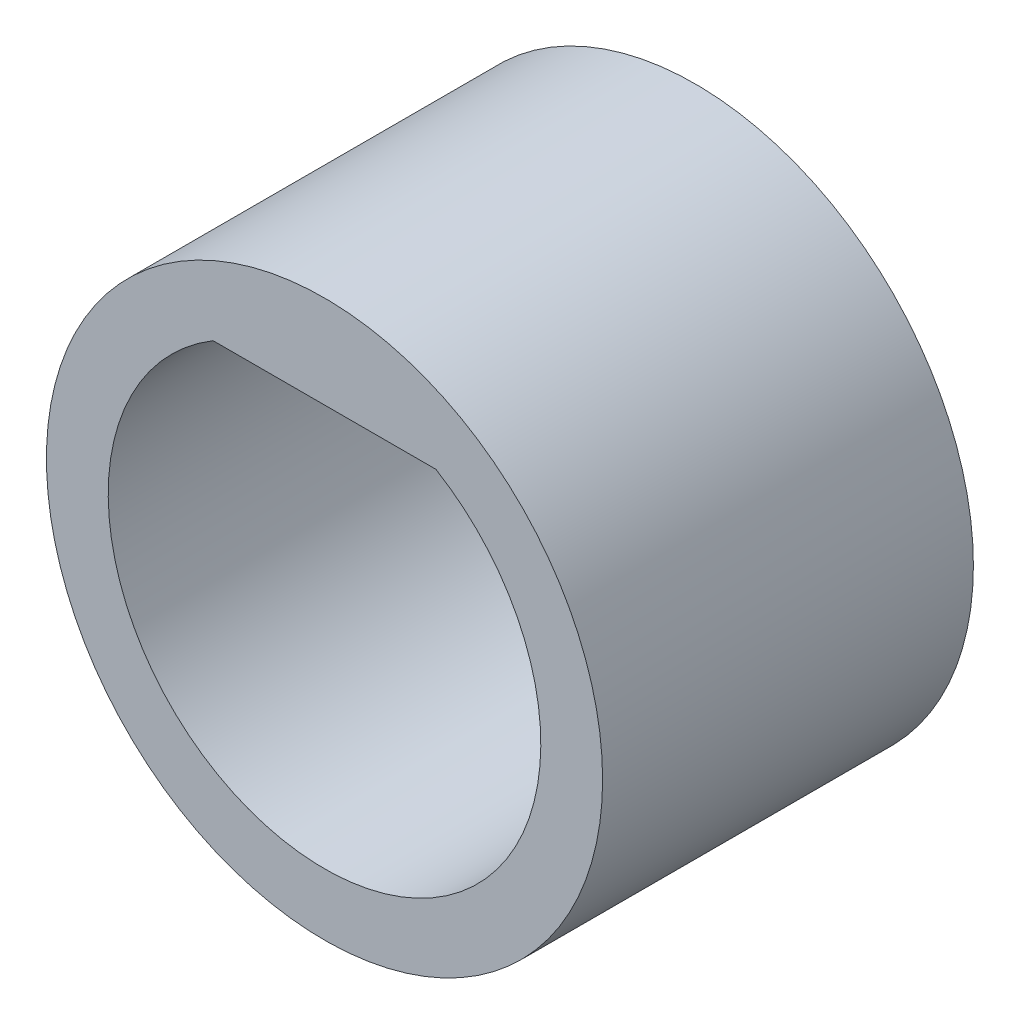
ISO-10303-21;
HEADER;
FILE_DESCRIPTION(('STEP AP214'),'2;1');
FILE_NAME('part.step','',(''),(''),'','','');
FILE_SCHEMA(('AUTOMOTIVE_DESIGN { 1 0 10303 214 1 1 1 1 }'));
ENDSEC;
DATA;
#1=APPLICATION_CONTEXT('core data for automotive mechanical design processes');
#2=APPLICATION_PROTOCOL_DEFINITION('international standard','automotive_design',2000,#1);
#3=PRODUCT_CONTEXT('',#1,'mechanical');
#4=PRODUCT('Part','Part','',(#3));
#5=PRODUCT_RELATED_PRODUCT_CATEGORY('part','',(#4));
#6=PRODUCT_DEFINITION_FORMATION('','',#4);
#7=PRODUCT_DEFINITION_CONTEXT('part definition',#1,'design');
#8=PRODUCT_DEFINITION('design','',#6,#7);
#9=PRODUCT_DEFINITION_SHAPE('','',#8);
#10=(LENGTH_UNIT() NAMED_UNIT(*) SI_UNIT(.MILLI.,.METRE.));
#11=(NAMED_UNIT(*) PLANE_ANGLE_UNIT() SI_UNIT($,.RADIAN.));
#12=(NAMED_UNIT(*) SI_UNIT($,.STERADIAN.) SOLID_ANGLE_UNIT());
#13=UNCERTAINTY_MEASURE_WITH_UNIT(LENGTH_MEASURE(1.E-05),#10,'distance_accuracy_value','');
#14=(GEOMETRIC_REPRESENTATION_CONTEXT(3) GLOBAL_UNCERTAINTY_ASSIGNED_CONTEXT((#13)) GLOBAL_UNIT_ASSIGNED_CONTEXT((#10,
#11,#12)) REPRESENTATION_CONTEXT('',''));
#15=CARTESIAN_POINT('',(0.,0.,0.));
#16=DIRECTION('',(0.,0.,1.));
#17=DIRECTION('',(1.,0.,0.));
#18=AXIS2_PLACEMENT_3D('',#15,#16,#17);
#19=CARTESIAN_POINT('',(0.,0.,6.));
#20=DIRECTION('',(0.,0.,-1.));
#21=DIRECTION('',(-1.,0.,0.));
#22=AXIS2_PLACEMENT_3D('',#19,#20,#21);
#23=CYLINDRICAL_SURFACE('',#22,4.5);
#24=CARTESIAN_POINT('',(0.,0.,6.));
#25=DIRECTION('',(0.,0.,1.));
#26=DIRECTION('',(1.,0.,0.));
#27=AXIS2_PLACEMENT_3D('',#24,#25,#26);
#28=CIRCLE('',#27,4.5);
#29=CARTESIAN_POINT('',(4.5,0.,6.));
#30=VERTEX_POINT('',#29);
#31=EDGE_CURVE('E90',#30,#30,#28,.T.);
#32=ORIENTED_EDGE('',*,*,#31,.F.);
#33=EDGE_LOOP('',(#32));
#34=FACE_BOUND('',#33,.T.);
#35=CARTESIAN_POINT('',(0.,0.,0.));
#36=DIRECTION('',(0.,0.,1.));
#37=DIRECTION('',(1.,0.,0.));
#38=AXIS2_PLACEMENT_3D('',#35,#36,#37);
#39=CIRCLE('',#38,4.5);
#40=CARTESIAN_POINT('',(4.5,0.,0.));
#41=VERTEX_POINT('',#40);
#42=EDGE_CURVE('E89',#41,#41,#39,.T.);
#43=ORIENTED_EDGE('',*,*,#42,.T.);
#44=EDGE_LOOP('',(#43));
#45=FACE_BOUND('',#44,.T.);
#46=ADVANCED_FACE('F45',(#34,#45),#23,.T.);
#47=CARTESIAN_POINT('',(0.,0.,6.));
#48=DIRECTION('',(0.,0.,1.));
#49=DIRECTION('',(1.,0.,0.));
#50=AXIS2_PLACEMENT_3D('',#47,#48,#49);
#51=PLANE('',#50);
#52=CARTESIAN_POINT('',(0.,0.,6.));
#53=DIRECTION('',(0.,0.,1.));
#54=DIRECTION('',(1.,0.,0.));
#55=AXIS2_PLACEMENT_3D('',#52,#53,#54);
#56=CIRCLE('',#55,3.5);
#57=CARTESIAN_POINT('',(-1.80277563773199,3.,6.));
#58=VERTEX_POINT('',#57);
#59=CARTESIAN_POINT('',(1.80277563773199,3.,6.));
#60=VERTEX_POINT('',#59);
#61=EDGE_CURVE('E11',#58,#60,#56,.T.);
#62=ORIENTED_EDGE('',*,*,#61,.F.);
#63=DIRECTION('',(1.,0.,0.));
#64=VECTOR('',#63,1.);
#65=CARTESIAN_POINT('',(-1.80277563773199,3.,6.));
#66=LINE('',#65,#64);
#67=EDGE_CURVE('E53',#60,#58,#66,.F.);
#68=ORIENTED_EDGE('',*,*,#67,.F.);
#69=EDGE_LOOP('',(#62,#68));
#70=FACE_BOUND('',#69,.T.);
#71=ORIENTED_EDGE('',*,*,#31,.T.);
#72=EDGE_LOOP('',(#71));
#73=FACE_BOUND('',#72,.T.);
#74=ADVANCED_FACE('F102',(#70,#73),#51,.T.);
#75=CARTESIAN_POINT('',(0.,0.,0.));
#76=DIRECTION('',(0.,0.,1.));
#77=DIRECTION('',(1.,0.,0.));
#78=AXIS2_PLACEMENT_3D('',#75,#76,#77);
#79=PLANE('',#78);
#80=ORIENTED_EDGE('',*,*,#42,.F.);
#81=EDGE_LOOP('',(#80));
#82=FACE_BOUND('',#81,.T.);
#83=ADVANCED_FACE('F100',(#82),#79,.F.);
#84=CARTESIAN_POINT('',(0.,0.,1.));
#85=DIRECTION('',(0.,0.,1.));
#86=DIRECTION('',(1.,0.,0.));
#87=AXIS2_PLACEMENT_3D('',#84,#85,#86);
#88=CYLINDRICAL_SURFACE('',#87,3.5);
#89=ORIENTED_EDGE('',*,*,#61,.T.);
#90=DIRECTION('',(0.,0.,1.));
#91=VECTOR('',#90,1.);
#92=CARTESIAN_POINT('',(1.80277563773199,3.,1.));
#93=LINE('',#92,#91);
#94=CARTESIAN_POINT('',(1.80277563773199,3.,1.));
#95=VERTEX_POINT('',#94);
#96=EDGE_CURVE('E60',#95,#60,#93,.T.);
#97=ORIENTED_EDGE('',*,*,#96,.F.);
#98=CARTESIAN_POINT('',(0.,0.,1.));
#99=DIRECTION('',(0.,0.,1.));
#100=DIRECTION('',(1.,0.,0.));
#101=AXIS2_PLACEMENT_3D('',#98,#99,#100);
#102=CIRCLE('',#101,3.5);
#103=CARTESIAN_POINT('',(-1.80277563773199,3.,1.));
#104=VERTEX_POINT('',#103);
#105=EDGE_CURVE('E72',#104,#95,#102,.T.);
#106=ORIENTED_EDGE('',*,*,#105,.F.);
#107=DIRECTION('',(0.,0.,1.));
#108=VECTOR('',#107,1.);
#109=CARTESIAN_POINT('',(-1.80277563773199,3.,1.));
#110=LINE('',#109,#108);
#111=EDGE_CURVE('E76',#104,#58,#110,.T.);
#112=ORIENTED_EDGE('',*,*,#111,.T.);
#113=EDGE_LOOP('',(#89,#97,#106,#112));
#114=FACE_BOUND('',#113,.T.);
#115=ADVANCED_FACE('F71',(#114),#88,.F.);
#116=CARTESIAN_POINT('',(-1.80277563773199,3.,1.));
#117=DIRECTION('',(0.,1.,0.));
#118=DIRECTION('',(0.,0.,1.));
#119=AXIS2_PLACEMENT_3D('',#116,#117,#118);
#120=PLANE('',#119);
#121=ORIENTED_EDGE('',*,*,#67,.T.);
#122=ORIENTED_EDGE('',*,*,#111,.F.);
#123=DIRECTION('',(-1.,0.,0.));
#124=VECTOR('',#123,1.);
#125=CARTESIAN_POINT('',(-1.80277563773199,3.,1.));
#126=LINE('',#125,#124);
#127=EDGE_CURVE('E77',#95,#104,#126,.T.);
#128=ORIENTED_EDGE('',*,*,#127,.F.);
#129=ORIENTED_EDGE('',*,*,#96,.T.);
#130=EDGE_LOOP('',(#121,#122,#128,#129));
#131=FACE_BOUND('',#130,.T.);
#132=ADVANCED_FACE('F83',(#131),#120,.F.);
#133=CARTESIAN_POINT('',(0.,0.,1.));
#134=DIRECTION('',(0.,0.,1.));
#135=DIRECTION('',(1.,0.,0.));
#136=AXIS2_PLACEMENT_3D('',#133,#134,#135);
#137=PLANE('',#136);
#138=ORIENTED_EDGE('',*,*,#105,.T.);
#139=ORIENTED_EDGE('',*,*,#127,.T.);
#140=EDGE_LOOP('',(#138,#139));
#141=FACE_BOUND('',#140,.T.);
#142=ADVANCED_FACE('F80',(#141),#137,.T.);
#143=CLOSED_SHELL('',(#46,#74,#83,#115,#132,#142));
#144=MANIFOLD_SOLID_BREP('B2',#143);
#145=ADVANCED_BREP_SHAPE_REPRESENTATION('',(#18,#144),#14);
#146=SHAPE_DEFINITION_REPRESENTATION(#9,#145);
ENDSEC;
END-ISO-10303-21;
